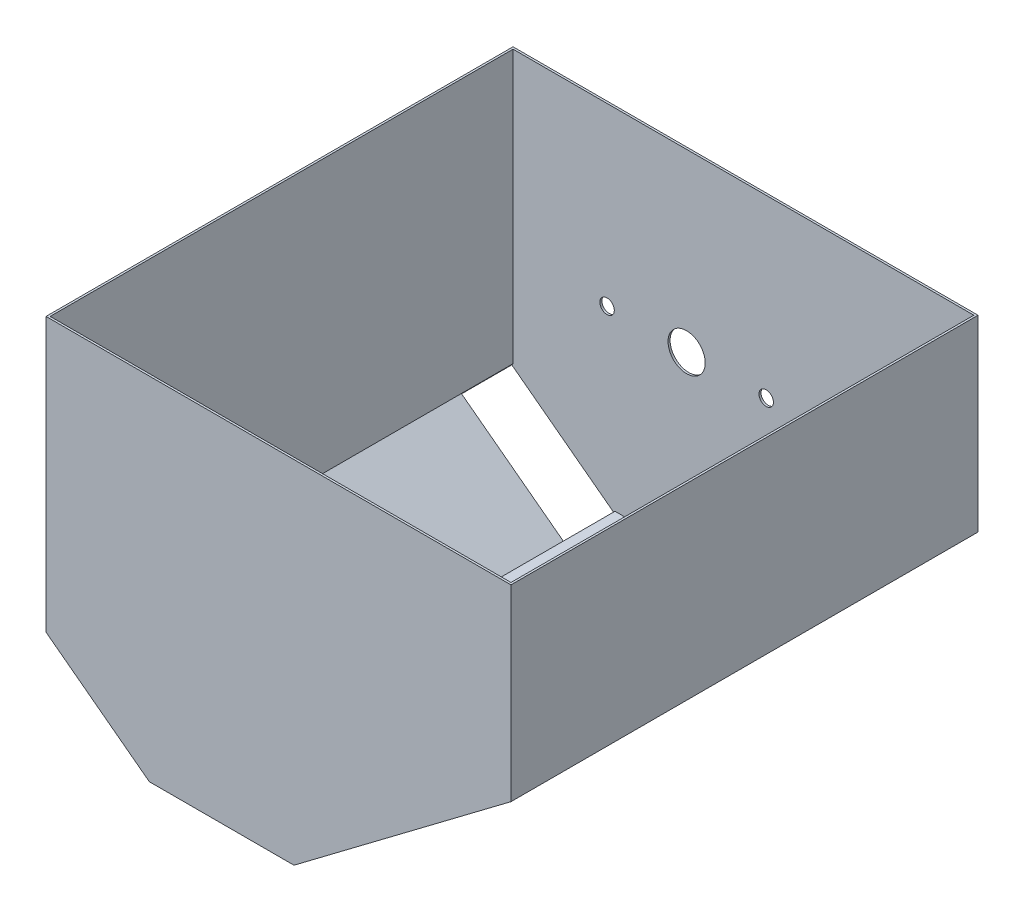
ISO-10303-21;
HEADER;
FILE_DESCRIPTION(('STEP AP214'),'2;1');
FILE_NAME('part.step','',(''),(''),'','','');
FILE_SCHEMA(('AUTOMOTIVE_DESIGN { 1 0 10303 214 1 1 1 1 }'));
ENDSEC;
DATA;
#1=APPLICATION_CONTEXT('core data for automotive mechanical design processes');
#2=APPLICATION_PROTOCOL_DEFINITION('international standard','automotive_design',2000,#1);
#3=PRODUCT_CONTEXT('',#1,'mechanical');
#4=PRODUCT('Part','Part','',(#3));
#5=PRODUCT_RELATED_PRODUCT_CATEGORY('part','',(#4));
#6=PRODUCT_DEFINITION_FORMATION('','',#4);
#7=PRODUCT_DEFINITION_CONTEXT('part definition',#1,'design');
#8=PRODUCT_DEFINITION('design','',#6,#7);
#9=PRODUCT_DEFINITION_SHAPE('','',#8);
#10=(LENGTH_UNIT() NAMED_UNIT(*) SI_UNIT(.MILLI.,.METRE.));
#11=(NAMED_UNIT(*) PLANE_ANGLE_UNIT() SI_UNIT($,.RADIAN.));
#12=(NAMED_UNIT(*) SI_UNIT($,.STERADIAN.) SOLID_ANGLE_UNIT());
#13=UNCERTAINTY_MEASURE_WITH_UNIT(LENGTH_MEASURE(1.E-05),#10,'distance_accuracy_value','');
#14=(GEOMETRIC_REPRESENTATION_CONTEXT(3) GLOBAL_UNCERTAINTY_ASSIGNED_CONTEXT((#13)) GLOBAL_UNIT_ASSIGNED_CONTEXT((#10,
#11,#12)) REPRESENTATION_CONTEXT('',''));
#15=CARTESIAN_POINT('',(0.,0.,0.));
#16=DIRECTION('',(0.,0.,1.));
#17=DIRECTION('',(1.,0.,0.));
#18=AXIS2_PLACEMENT_3D('',#15,#16,#17);
#19=CARTESIAN_POINT('',(-170.,-94.6445949897203,2.));
#20=DIRECTION('',(0.601815023152049,0.798635510047292,0.));
#21=DIRECTION('',(-0.798635510047292,0.60181502315205,0.));
#22=AXIS2_PLACEMENT_3D('',#19,#20,#21);
#23=PLANE('',#22);
#24=DIRECTION('',(-0.798635510047292,0.60181502315205,0.));
#25=VECTOR('',#24,1.);
#26=CARTESIAN_POINT('',(-169.203630046304,-95.2447027937081,2.));
#27=LINE('',#26,#25);
#28=CARTESIAN_POINT('',(-70.5344394073,-169.597271020095,2.));
#29=VERTEX_POINT('',#28);
#30=CARTESIAN_POINT('',(-169.203630046304,-95.2447027937081,2.));
#31=VERTEX_POINT('',#30);
#32=EDGE_CURVE('E153',#29,#31,#27,.T.);
#33=ORIENTED_EDGE('',*,*,#32,.T.);
#34=DIRECTION('',(0.,0.,1.));
#35=VECTOR('',#34,1.);
#36=CARTESIAN_POINT('',(-169.203630046304,-95.2447027937081,2.));
#37=LINE('',#36,#35);
#38=CARTESIAN_POINT('',(-169.203630046304,-95.2447027937081,52.));
#39=VERTEX_POINT('',#38);
#40=EDGE_CURVE('E146',#31,#39,#37,.T.);
#41=ORIENTED_EDGE('',*,*,#40,.T.);
#42=DIRECTION('',(0.798635510047292,-0.60181502315205,0.));
#43=VECTOR('',#42,1.);
#44=CARTESIAN_POINT('',(-169.203630046304,-95.2447027937081,52.));
#45=LINE('',#44,#43);
#46=CARTESIAN_POINT('',(-70.5344394072998,-169.597271020095,52.));
#47=VERTEX_POINT('',#46);
#48=EDGE_CURVE('E156',#39,#47,#45,.T.);
#49=ORIENTED_EDGE('',*,*,#48,.T.);
#50=DIRECTION('',(0.,0.,-1.));
#51=VECTOR('',#50,1.);
#52=CARTESIAN_POINT('',(-70.5344394073,-169.597271020095,2.));
#53=LINE('',#52,#51);
#54=EDGE_CURVE('E52',#47,#29,#53,.T.);
#55=ORIENTED_EDGE('',*,*,#54,.T.);
#56=EDGE_LOOP('',(#33,#41,#49,#55));
#57=FACE_BOUND('',#56,.T.);
#58=DIRECTION('',(0.798635510047292,-0.601815023152049,0.));
#59=VECTOR('',#58,1.);
#60=CARTESIAN_POINT('',(-170.,-94.6445949897203,0.));
#61=LINE('',#60,#59);
#62=CARTESIAN_POINT('',(-170.,-94.6445949897203,0.));
#63=VERTEX_POINT('',#62);
#64=CARTESIAN_POINT('',(-70.,-170.,0.));
#65=VERTEX_POINT('',#64);
#66=EDGE_CURVE('E244',#63,#65,#61,.T.);
#67=ORIENTED_EDGE('',*,*,#66,.T.);
#68=DIRECTION('',(0.,0.,-1.));
#69=VECTOR('',#68,1.);
#70=CARTESIAN_POINT('',(-70.,-170.,2.));
#71=LINE('',#70,#69);
#72=CARTESIAN_POINT('',(-70.,-170.,452.));
#73=VERTEX_POINT('',#72);
#74=EDGE_CURVE('E45',#73,#65,#71,.T.);
#75=ORIENTED_EDGE('',*,*,#74,.F.);
#76=DIRECTION('',(0.798635510047292,-0.601815023152049,0.));
#77=VECTOR('',#76,1.);
#78=CARTESIAN_POINT('',(-70.,-170.,452.));
#79=LINE('',#78,#77);
#80=CARTESIAN_POINT('',(-170.,-94.6445949897203,452.));
#81=VERTEX_POINT('',#80);
#82=EDGE_CURVE('E205',#81,#73,#79,.T.);
#83=ORIENTED_EDGE('',*,*,#82,.F.);
#84=DIRECTION('',(0.,0.,-1.));
#85=VECTOR('',#84,1.);
#86=CARTESIAN_POINT('',(-170.,-94.6445949897203,2.));
#87=LINE('',#86,#85);
#88=EDGE_CURVE('E248',#81,#63,#87,.T.);
#89=ORIENTED_EDGE('',*,*,#88,.T.);
#90=EDGE_LOOP('',(#67,#75,#83,#89));
#91=FACE_BOUND('',#90,.T.);
#92=ADVANCED_FACE('F38',(#57,#91),#23,.F.);
#93=CARTESIAN_POINT('',(-70.,-170.,2.));
#94=DIRECTION('',(0.,1.,0.));
#95=DIRECTION('',(-1.,0.,0.));
#96=AXIS2_PLACEMENT_3D('',#93,#94,#95);
#97=PLANE('',#96);
#98=DIRECTION('',(1.,0.,0.));
#99=VECTOR('',#98,1.);
#100=CARTESIAN_POINT('',(-70.,-170.,0.));
#101=LINE('',#100,#99);
#102=CARTESIAN_POINT('',(70.,-170.,0.));
#103=VERTEX_POINT('',#102);
#104=EDGE_CURVE('E252',#65,#103,#101,.T.);
#105=ORIENTED_EDGE('',*,*,#104,.T.);
#106=DIRECTION('',(0.,0.,-1.));
#107=VECTOR('',#106,1.);
#108=CARTESIAN_POINT('',(70.,-170.,2.));
#109=LINE('',#108,#107);
#110=CARTESIAN_POINT('',(70.,-170.,452.));
#111=VERTEX_POINT('',#110);
#112=EDGE_CURVE('E273',#111,#103,#109,.T.);
#113=ORIENTED_EDGE('',*,*,#112,.F.);
#114=DIRECTION('',(1.,0.,0.));
#115=VECTOR('',#114,1.);
#116=CARTESIAN_POINT('',(70.,-170.,452.));
#117=LINE('',#116,#115);
#118=EDGE_CURVE('E209',#73,#111,#117,.T.);
#119=ORIENTED_EDGE('',*,*,#118,.F.);
#120=ORIENTED_EDGE('',*,*,#74,.T.);
#121=EDGE_LOOP('',(#105,#113,#119,#120));
#122=FACE_BOUND('',#121,.T.);
#123=ADVANCED_FACE('F277',(#122),#97,.F.);
#124=CARTESIAN_POINT('',(70.,-170.,2.));
#125=DIRECTION('',(-0.60181502315205,0.798635510047292,0.));
#126=DIRECTION('',(-0.798635510047292,-0.60181502315205,0.));
#127=AXIS2_PLACEMENT_3D('',#124,#125,#126);
#128=PLANE('',#127);
#129=DIRECTION('',(0.798635510047292,0.60181502315205,0.));
#130=VECTOR('',#129,1.);
#131=CARTESIAN_POINT('',(70.,-170.,0.));
#132=LINE('',#131,#130);
#133=CARTESIAN_POINT('',(280.,-11.7536494784126,0.));
#134=VERTEX_POINT('',#133);
#135=EDGE_CURVE('E255',#103,#134,#132,.T.);
#136=ORIENTED_EDGE('',*,*,#135,.T.);
#137=DIRECTION('',(0.,0.,-1.));
#138=VECTOR('',#137,1.);
#139=CARTESIAN_POINT('',(280.,-11.7536494784126,2.));
#140=LINE('',#139,#138);
#141=CARTESIAN_POINT('',(280.,-11.7536494784126,452.));
#142=VERTEX_POINT('',#141);
#143=EDGE_CURVE('E271',#142,#134,#140,.T.);
#144=ORIENTED_EDGE('',*,*,#143,.F.);
#145=DIRECTION('',(0.798635510047292,0.60181502315205,0.));
#146=VECTOR('',#145,1.);
#147=CARTESIAN_POINT('',(280.,-11.7536494784126,452.));
#148=LINE('',#147,#146);
#149=EDGE_CURVE('E212',#111,#142,#148,.T.);
#150=ORIENTED_EDGE('',*,*,#149,.F.);
#151=ORIENTED_EDGE('',*,*,#112,.T.);
#152=EDGE_LOOP('',(#136,#144,#150,#151));
#153=FACE_BOUND('',#152,.T.);
#154=ADVANCED_FACE('F298',(#153),#128,.F.);
#155=CARTESIAN_POINT('',(280.,-11.7536494784126,2.));
#156=DIRECTION('',(-1.,0.,0.));
#157=DIRECTION('',(0.,-1.,0.));
#158=AXIS2_PLACEMENT_3D('',#155,#156,#157);
#159=PLANE('',#158);
#160=DIRECTION('',(0.,1.,0.));
#161=VECTOR('',#160,1.);
#162=CARTESIAN_POINT('',(280.,-11.7536494784126,0.));
#163=LINE('',#162,#161);
#164=CARTESIAN_POINT('',(280.,170.,0.));
#165=VERTEX_POINT('',#164);
#166=EDGE_CURVE('E258',#134,#165,#163,.T.);
#167=ORIENTED_EDGE('',*,*,#166,.T.);
#168=DIRECTION('',(0.,0.,-1.));
#169=VECTOR('',#168,1.);
#170=CARTESIAN_POINT('',(280.,170.,2.));
#171=LINE('',#170,#169);
#172=CARTESIAN_POINT('',(280.,170.,452.));
#173=VERTEX_POINT('',#172);
#174=EDGE_CURVE('E269',#173,#165,#171,.T.);
#175=ORIENTED_EDGE('',*,*,#174,.F.);
#176=DIRECTION('',(0.,1.,0.));
#177=VECTOR('',#176,1.);
#178=CARTESIAN_POINT('',(280.,170.,452.));
#179=LINE('',#178,#177);
#180=EDGE_CURVE('E215',#142,#173,#179,.T.);
#181=ORIENTED_EDGE('',*,*,#180,.F.);
#182=ORIENTED_EDGE('',*,*,#143,.T.);
#183=EDGE_LOOP('',(#167,#175,#181,#182));
#184=FACE_BOUND('',#183,.T.);
#185=ADVANCED_FACE('F295',(#184),#159,.F.);
#186=CARTESIAN_POINT('',(280.,170.,2.));
#187=DIRECTION('',(0.,-1.,0.));
#188=DIRECTION('',(1.,0.,0.));
#189=AXIS2_PLACEMENT_3D('',#186,#187,#188);
#190=PLANE('',#189);
#191=DIRECTION('',(-1.,0.,0.));
#192=VECTOR('',#191,1.);
#193=CARTESIAN_POINT('',(-170.,170.,450.));
#194=LINE('',#193,#192);
#195=CARTESIAN_POINT('',(278.,170.,450.));
#196=VERTEX_POINT('',#195);
#197=CARTESIAN_POINT('',(-168.,170.,450.));
#198=VERTEX_POINT('',#197);
#199=EDGE_CURVE('E184',#196,#198,#194,.T.);
#200=ORIENTED_EDGE('',*,*,#199,.T.);
#201=DIRECTION('',(0.,0.,-1.));
#202=VECTOR('',#201,1.);
#203=CARTESIAN_POINT('',(-168.,170.,452.));
#204=LINE('',#203,#202);
#205=CARTESIAN_POINT('',(-168.,170.,2.));
#206=VERTEX_POINT('',#205);
#207=EDGE_CURVE('E220',#198,#206,#204,.T.);
#208=ORIENTED_EDGE('',*,*,#207,.T.);
#209=DIRECTION('',(-1.,0.,0.));
#210=VECTOR('',#209,1.);
#211=CARTESIAN_POINT('',(280.,170.,2.));
#212=LINE('',#211,#210);
#213=CARTESIAN_POINT('',(278.,170.,2.));
#214=VERTEX_POINT('',#213);
#215=EDGE_CURVE('E245',#214,#206,#212,.T.);
#216=ORIENTED_EDGE('',*,*,#215,.F.);
#217=DIRECTION('',(0.,0.,-1.));
#218=VECTOR('',#217,1.);
#219=CARTESIAN_POINT('',(278.,170.,452.));
#220=LINE('',#219,#218);
#221=EDGE_CURVE('E242',#196,#214,#220,.T.);
#222=ORIENTED_EDGE('',*,*,#221,.F.);
#223=EDGE_LOOP('',(#200,#208,#216,#222));
#224=FACE_BOUND('',#223,.T.);
#225=DIRECTION('',(-1.,0.,0.));
#226=VECTOR('',#225,1.);
#227=CARTESIAN_POINT('',(280.,170.,0.));
#228=LINE('',#227,#226);
#229=CARTESIAN_POINT('',(-170.,170.,0.));
#230=VERTEX_POINT('',#229);
#231=EDGE_CURVE('E261',#165,#230,#228,.T.);
#232=ORIENTED_EDGE('',*,*,#231,.T.);
#233=DIRECTION('',(0.,0.,-1.));
#234=VECTOR('',#233,1.);
#235=CARTESIAN_POINT('',(-170.,170.,2.));
#236=LINE('',#235,#234);
#237=CARTESIAN_POINT('',(-170.,170.,452.));
#238=VERTEX_POINT('',#237);
#239=EDGE_CURVE('E267',#238,#230,#236,.T.);
#240=ORIENTED_EDGE('',*,*,#239,.F.);
#241=DIRECTION('',(-1.,0.,0.));
#242=VECTOR('',#241,1.);
#243=CARTESIAN_POINT('',(278.,170.,452.));
#244=LINE('',#243,#242);
#245=EDGE_CURVE('E218',#173,#238,#244,.T.);
#246=ORIENTED_EDGE('',*,*,#245,.F.);
#247=ORIENTED_EDGE('',*,*,#174,.T.);
#248=EDGE_LOOP('',(#232,#240,#246,#247));
#249=FACE_BOUND('',#248,.T.);
#250=ADVANCED_FACE('F291',(#224,#249),#190,.F.);
#251=CARTESIAN_POINT('',(-170.,170.,2.));
#252=DIRECTION('',(1.,0.,0.));
#253=DIRECTION('',(0.,1.,0.));
#254=AXIS2_PLACEMENT_3D('',#251,#252,#253);
#255=PLANE('',#254);
#256=DIRECTION('',(0.,-1.,0.));
#257=VECTOR('',#256,1.);
#258=CARTESIAN_POINT('',(-170.,170.,0.));
#259=LINE('',#258,#257);
#260=EDGE_CURVE('E249',#230,#63,#259,.T.);
#261=ORIENTED_EDGE('',*,*,#260,.T.);
#262=ORIENTED_EDGE('',*,*,#88,.F.);
#263=DIRECTION('',(0.,-1.,0.));
#264=VECTOR('',#263,1.);
#265=CARTESIAN_POINT('',(-170.,-94.6445949897203,452.));
#266=LINE('',#265,#264);
#267=EDGE_CURVE('E202',#238,#81,#266,.T.);
#268=ORIENTED_EDGE('',*,*,#267,.F.);
#269=ORIENTED_EDGE('',*,*,#239,.T.);
#270=EDGE_LOOP('',(#261,#262,#268,#269));
#271=FACE_BOUND('',#270,.T.);
#272=ADVANCED_FACE('F287',(#271),#255,.F.);
#273=CARTESIAN_POINT('',(0.,0.,2.));
#274=DIRECTION('',(0.,0.,1.));
#275=DIRECTION('',(1.,0.,0.));
#276=AXIS2_PLACEMENT_3D('',#273,#274,#275);
#277=PLANE('',#276);
#278=CARTESIAN_POINT('',(-77.,0.,2.));
#279=DIRECTION('',(0.,0.,-1.));
#280=DIRECTION('',(-1.,0.,0.));
#281=AXIS2_PLACEMENT_3D('',#278,#279,#280);
#282=CIRCLE('',#281,7.);
#283=CARTESIAN_POINT('',(-84.,0.,2.));
#284=VERTEX_POINT('',#283);
#285=EDGE_CURVE('E174',#284,#284,#282,.T.);
#286=ORIENTED_EDGE('',*,*,#285,.T.);
#287=EDGE_LOOP('',(#286));
#288=FACE_BOUND('',#287,.T.);
#289=CARTESIAN_POINT('',(77.,0.,2.));
#290=DIRECTION('',(0.,0.,-1.));
#291=DIRECTION('',(1.,0.,0.));
#292=AXIS2_PLACEMENT_3D('',#289,#290,#291);
#293=CIRCLE('',#292,7.);
#294=CARTESIAN_POINT('',(84.,0.,2.));
#295=VERTEX_POINT('',#294);
#296=EDGE_CURVE('E168',#295,#295,#293,.T.);
#297=ORIENTED_EDGE('',*,*,#296,.T.);
#298=EDGE_LOOP('',(#297));
#299=FACE_BOUND('',#298,.T.);
#300=CARTESIAN_POINT('',(0.,0.,2.));
#301=DIRECTION('',(0.,0.,1.));
#302=DIRECTION('',(1.,0.,0.));
#303=AXIS2_PLACEMENT_3D('',#300,#301,#302);
#304=CIRCLE('',#303,18.);
#305=CARTESIAN_POINT('',(18.,0.,2.));
#306=VERTEX_POINT('',#305);
#307=EDGE_CURVE('E177',#306,#306,#304,.T.);
#308=ORIENTED_EDGE('',*,*,#307,.F.);
#309=EDGE_LOOP('',(#308));
#310=FACE_BOUND('',#309,.T.);
#311=DIRECTION('',(0.,1.,0.));
#312=VECTOR('',#311,1.);
#313=CARTESIAN_POINT('',(-168.,170.,2.));
#314=LINE('',#313,#312);
#315=CARTESIAN_POINT('',(-168.,-93.6474317736134,2.));
#316=VERTEX_POINT('',#315);
#317=EDGE_CURVE('E206',#316,#206,#314,.T.);
#318=ORIENTED_EDGE('',*,*,#317,.F.);
#319=DIRECTION('',(0.60181502315205,0.798635510047292,0.));
#320=VECTOR('',#319,1.);
#321=CARTESIAN_POINT('',(-169.203630046304,-95.2447027937081,2.));
#322=LINE('',#321,#320);
#323=EDGE_CURVE('E60',#31,#316,#322,.T.);
#324=ORIENTED_EDGE('',*,*,#323,.F.);
#325=ORIENTED_EDGE('',*,*,#32,.F.);
#326=DIRECTION('',(0.60181502315205,0.798635510047292,0.));
#327=VECTOR('',#326,1.);
#328=CARTESIAN_POINT('',(-70.5344394073,-169.597271020095,2.));
#329=LINE('',#328,#327);
#330=CARTESIAN_POINT('',(-69.3308093609959,-168.,2.));
#331=VERTEX_POINT('',#330);
#332=EDGE_CURVE('E178',#29,#331,#329,.T.);
#333=ORIENTED_EDGE('',*,*,#332,.T.);
#334=DIRECTION('',(-1.,0.,0.));
#335=VECTOR('',#334,1.);
#336=CARTESIAN_POINT('',(-69.3308093609958,-168.,2.));
#337=LINE('',#336,#335);
#338=CARTESIAN_POINT('',(69.3308093609959,-168.,2.));
#339=VERTEX_POINT('',#338);
#340=EDGE_CURVE('E226',#339,#331,#337,.T.);
#341=ORIENTED_EDGE('',*,*,#340,.F.);
#342=DIRECTION('',(-0.798635510047292,-0.60181502315205,0.));
#343=VECTOR('',#342,1.);
#344=CARTESIAN_POINT('',(69.3308093609959,-168.,2.));
#345=LINE('',#344,#343);
#346=CARTESIAN_POINT('',(278.,-10.7564862623057,2.));
#347=VERTEX_POINT('',#346);
#348=EDGE_CURVE('E223',#347,#339,#345,.T.);
#349=ORIENTED_EDGE('',*,*,#348,.F.);
#350=DIRECTION('',(0.,-1.,0.));
#351=VECTOR('',#350,1.);
#352=CARTESIAN_POINT('',(278.,-10.7564862623057,2.));
#353=LINE('',#352,#351);
#354=EDGE_CURVE('E201',#214,#347,#353,.T.);
#355=ORIENTED_EDGE('',*,*,#354,.F.);
#356=ORIENTED_EDGE('',*,*,#215,.T.);
#357=EDGE_LOOP('',(#318,#324,#325,#333,#341,#349,#355,#356));
#358=FACE_BOUND('',#357,.T.);
#359=ADVANCED_FACE('F331',(#288,#299,#310,#358),#277,.T.);
#360=CARTESIAN_POINT('',(0.,0.,0.));
#361=DIRECTION('',(0.,0.,1.));
#362=DIRECTION('',(1.,0.,0.));
#363=AXIS2_PLACEMENT_3D('',#360,#361,#362);
#364=PLANE('',#363);
#365=CARTESIAN_POINT('',(-77.,0.,0.));
#366=DIRECTION('',(0.,0.,-1.));
#367=DIRECTION('',(-1.,0.,0.));
#368=AXIS2_PLACEMENT_3D('',#365,#366,#367);
#369=CIRCLE('',#368,7.);
#370=CARTESIAN_POINT('',(-84.,0.,0.));
#371=VERTEX_POINT('',#370);
#372=EDGE_CURVE('E584',#371,#371,#369,.T.);
#373=ORIENTED_EDGE('',*,*,#372,.F.);
#374=EDGE_LOOP('',(#373));
#375=FACE_BOUND('',#374,.T.);
#376=CARTESIAN_POINT('',(77.,0.,0.));
#377=DIRECTION('',(0.,0.,-1.));
#378=DIRECTION('',(1.,0.,0.));
#379=AXIS2_PLACEMENT_3D('',#376,#377,#378);
#380=CIRCLE('',#379,7.);
#381=CARTESIAN_POINT('',(84.,0.,0.));
#382=VERTEX_POINT('',#381);
#383=EDGE_CURVE('E585',#382,#382,#380,.T.);
#384=ORIENTED_EDGE('',*,*,#383,.F.);
#385=EDGE_LOOP('',(#384));
#386=FACE_BOUND('',#385,.T.);
#387=CARTESIAN_POINT('',(0.,0.,0.));
#388=DIRECTION('',(0.,0.,1.));
#389=DIRECTION('',(1.,0.,0.));
#390=AXIS2_PLACEMENT_3D('',#387,#388,#389);
#391=CIRCLE('',#390,18.);
#392=CARTESIAN_POINT('',(18.,0.,0.));
#393=VERTEX_POINT('',#392);
#394=EDGE_CURVE('E181',#393,#393,#391,.T.);
#395=ORIENTED_EDGE('',*,*,#394,.T.);
#396=EDGE_LOOP('',(#395));
#397=FACE_BOUND('',#396,.T.);
#398=ORIENTED_EDGE('',*,*,#66,.F.);
#399=ORIENTED_EDGE('',*,*,#260,.F.);
#400=ORIENTED_EDGE('',*,*,#231,.F.);
#401=ORIENTED_EDGE('',*,*,#166,.F.);
#402=ORIENTED_EDGE('',*,*,#135,.F.);
#403=ORIENTED_EDGE('',*,*,#104,.F.);
#404=EDGE_LOOP('',(#398,#399,#400,#401,#402,#403));
#405=FACE_BOUND('',#404,.T.);
#406=ADVANCED_FACE('F282',(#375,#386,#397,#405),#364,.F.);
#407=CARTESIAN_POINT('',(278.,-10.7564862623057,452.));
#408=DIRECTION('',(1.,0.,0.));
#409=DIRECTION('',(0.,1.,0.));
#410=AXIS2_PLACEMENT_3D('',#407,#408,#409);
#411=PLANE('',#410);
#412=DIRECTION('',(0.,0.,-1.));
#413=VECTOR('',#412,1.);
#414=CARTESIAN_POINT('',(278.,-10.7564862623057,452.));
#415=LINE('',#414,#413);
#416=CARTESIAN_POINT('',(278.,-10.7564862623057,450.));
#417=VERTEX_POINT('',#416);
#418=EDGE_CURVE('E240',#417,#347,#415,.T.);
#419=ORIENTED_EDGE('',*,*,#418,.F.);
#420=DIRECTION('',(0.,1.,0.));
#421=VECTOR('',#420,1.);
#422=CARTESIAN_POINT('',(278.,-10.7564862623057,450.));
#423=LINE('',#422,#421);
#424=EDGE_CURVE('E198',#417,#196,#423,.T.);
#425=ORIENTED_EDGE('',*,*,#424,.T.);
#426=ORIENTED_EDGE('',*,*,#221,.T.);
#427=ORIENTED_EDGE('',*,*,#354,.T.);
#428=EDGE_LOOP('',(#419,#425,#426,#427));
#429=FACE_BOUND('',#428,.T.);
#430=ADVANCED_FACE('F334',(#429),#411,.F.);
#431=CARTESIAN_POINT('',(69.3308093609959,-168.,452.));
#432=DIRECTION('',(0.60181502315205,-0.798635510047292,0.));
#433=DIRECTION('',(0.798635510047292,0.60181502315205,0.));
#434=AXIS2_PLACEMENT_3D('',#431,#432,#433);
#435=PLANE('',#434);
#436=DIRECTION('',(0.,0.,-1.));
#437=VECTOR('',#436,1.);
#438=CARTESIAN_POINT('',(69.3308093609959,-168.,452.));
#439=LINE('',#438,#437);
#440=CARTESIAN_POINT('',(69.3308093609959,-168.,450.));
#441=VERTEX_POINT('',#440);
#442=EDGE_CURVE('E238',#441,#339,#439,.T.);
#443=ORIENTED_EDGE('',*,*,#442,.F.);
#444=DIRECTION('',(0.798635510047292,0.60181502315205,0.));
#445=VECTOR('',#444,1.);
#446=CARTESIAN_POINT('',(69.3308093609959,-168.,450.));
#447=LINE('',#446,#445);
#448=EDGE_CURVE('E195',#441,#417,#447,.T.);
#449=ORIENTED_EDGE('',*,*,#448,.T.);
#450=ORIENTED_EDGE('',*,*,#418,.T.);
#451=ORIENTED_EDGE('',*,*,#348,.T.);
#452=EDGE_LOOP('',(#443,#449,#450,#451));
#453=FACE_BOUND('',#452,.T.);
#454=ADVANCED_FACE('F341',(#453),#435,.F.);
#455=CARTESIAN_POINT('',(-69.3308093609958,-168.,452.));
#456=DIRECTION('',(0.,-1.,0.));
#457=DIRECTION('',(0.,0.,-1.));
#458=AXIS2_PLACEMENT_3D('',#455,#456,#457);
#459=PLANE('',#458);
#460=DIRECTION('',(0.,0.,-1.));
#461=VECTOR('',#460,1.);
#462=CARTESIAN_POINT('',(-69.3308093609958,-168.,452.));
#463=LINE('',#462,#461);
#464=CARTESIAN_POINT('',(-69.3308093609958,-168.,450.));
#465=VERTEX_POINT('',#464);
#466=CARTESIAN_POINT('',(-69.3308093609959,-168.,52.));
#467=VERTEX_POINT('',#466);
#468=EDGE_CURVE('E235',#465,#467,#463,.T.);
#469=ORIENTED_EDGE('',*,*,#468,.F.);
#470=DIRECTION('',(1.,0.,0.));
#471=VECTOR('',#470,1.);
#472=CARTESIAN_POINT('',(-69.3308093609958,-168.,450.));
#473=LINE('',#472,#471);
#474=EDGE_CURVE('E192',#465,#441,#473,.T.);
#475=ORIENTED_EDGE('',*,*,#474,.T.);
#476=ORIENTED_EDGE('',*,*,#442,.T.);
#477=ORIENTED_EDGE('',*,*,#340,.T.);
#478=DIRECTION('',(0.,0.,-1.));
#479=VECTOR('',#478,1.);
#480=CARTESIAN_POINT('',(-69.3308093609959,-168.,2.));
#481=LINE('',#480,#479);
#482=EDGE_CURVE('E162',#467,#331,#481,.T.);
#483=ORIENTED_EDGE('',*,*,#482,.F.);
#484=EDGE_LOOP('',(#469,#475,#476,#477,#483));
#485=FACE_BOUND('',#484,.T.);
#486=ADVANCED_FACE('F345',(#485),#459,.F.);
#487=CARTESIAN_POINT('',(-168.,-93.6474317736134,452.));
#488=DIRECTION('',(-0.601815023152049,-0.798635510047292,0.));
#489=DIRECTION('',(0.798635510047292,-0.601815023152049,0.));
#490=AXIS2_PLACEMENT_3D('',#487,#488,#489);
#491=PLANE('',#490);
#492=ORIENTED_EDGE('',*,*,#468,.T.);
#493=DIRECTION('',(0.798635510047292,-0.60181502315205,0.));
#494=VECTOR('',#493,1.);
#495=CARTESIAN_POINT('',(-168.,-93.6474317736135,52.));
#496=LINE('',#495,#494);
#497=CARTESIAN_POINT('',(-168.,-93.6474317736135,52.));
#498=VERTEX_POINT('',#497);
#499=EDGE_CURVE('E165',#498,#467,#496,.T.);
#500=ORIENTED_EDGE('',*,*,#499,.F.);
#501=DIRECTION('',(0.,0.,-1.));
#502=VECTOR('',#501,1.);
#503=CARTESIAN_POINT('',(-168.,-93.6474317736134,452.));
#504=LINE('',#503,#502);
#505=CARTESIAN_POINT('',(-168.,-93.6474317736135,450.));
#506=VERTEX_POINT('',#505);
#507=EDGE_CURVE('E232',#506,#498,#504,.T.);
#508=ORIENTED_EDGE('',*,*,#507,.F.);
#509=DIRECTION('',(0.798635510047292,-0.601815023152049,0.));
#510=VECTOR('',#509,1.);
#511=CARTESIAN_POINT('',(-168.,-93.6474317736134,450.));
#512=LINE('',#511,#510);
#513=EDGE_CURVE('E189',#506,#465,#512,.T.);
#514=ORIENTED_EDGE('',*,*,#513,.T.);
#515=EDGE_LOOP('',(#492,#500,#508,#514));
#516=FACE_BOUND('',#515,.T.);
#517=ADVANCED_FACE('F312',(#516),#491,.F.);
#518=CARTESIAN_POINT('',(-168.,170.,452.));
#519=DIRECTION('',(-1.,0.,0.));
#520=DIRECTION('',(0.,-1.,0.));
#521=AXIS2_PLACEMENT_3D('',#518,#519,#520);
#522=PLANE('',#521);
#523=ORIENTED_EDGE('',*,*,#207,.F.);
#524=DIRECTION('',(0.,-1.,0.));
#525=VECTOR('',#524,1.);
#526=CARTESIAN_POINT('',(-168.,170.,450.));
#527=LINE('',#526,#525);
#528=EDGE_CURVE('E11',#198,#506,#527,.T.);
#529=ORIENTED_EDGE('',*,*,#528,.T.);
#530=ORIENTED_EDGE('',*,*,#507,.T.);
#531=DIRECTION('',(0.,0.,1.));
#532=VECTOR('',#531,1.);
#533=CARTESIAN_POINT('',(-168.,-93.6474317736135,2.));
#534=LINE('',#533,#532);
#535=EDGE_CURVE('E148',#316,#498,#534,.T.);
#536=ORIENTED_EDGE('',*,*,#535,.F.);
#537=ORIENTED_EDGE('',*,*,#317,.T.);
#538=EDGE_LOOP('',(#523,#529,#530,#536,#537));
#539=FACE_BOUND('',#538,.T.);
#540=ADVANCED_FACE('F303',(#539),#522,.F.);
#541=CARTESIAN_POINT('',(0.,0.,452.));
#542=DIRECTION('',(0.,0.,-1.));
#543=DIRECTION('',(-1.,0.,0.));
#544=AXIS2_PLACEMENT_3D('',#541,#542,#543);
#545=PLANE('',#544);
#546=ORIENTED_EDGE('',*,*,#267,.T.);
#547=ORIENTED_EDGE('',*,*,#82,.T.);
#548=ORIENTED_EDGE('',*,*,#118,.T.);
#549=ORIENTED_EDGE('',*,*,#149,.T.);
#550=ORIENTED_EDGE('',*,*,#180,.T.);
#551=ORIENTED_EDGE('',*,*,#245,.T.);
#552=EDGE_LOOP('',(#546,#547,#548,#549,#550,#551));
#553=FACE_BOUND('',#552,.T.);
#554=ADVANCED_FACE('F300',(#553),#545,.F.);
#555=CARTESIAN_POINT('',(0.,0.,450.));
#556=DIRECTION('',(0.,0.,-1.));
#557=DIRECTION('',(-1.,0.,0.));
#558=AXIS2_PLACEMENT_3D('',#555,#556,#557);
#559=PLANE('',#558);
#560=ORIENTED_EDGE('',*,*,#424,.F.);
#561=ORIENTED_EDGE('',*,*,#448,.F.);
#562=ORIENTED_EDGE('',*,*,#474,.F.);
#563=ORIENTED_EDGE('',*,*,#513,.F.);
#564=ORIENTED_EDGE('',*,*,#528,.F.);
#565=ORIENTED_EDGE('',*,*,#199,.F.);
#566=EDGE_LOOP('',(#560,#561,#562,#563,#564,#565));
#567=FACE_BOUND('',#566,.T.);
#568=ADVANCED_FACE('F302',(#567),#559,.T.);
#569=CARTESIAN_POINT('',(0.,0.,0.));
#570=DIRECTION('',(0.,0.,1.));
#571=DIRECTION('',(1.,0.,0.));
#572=AXIS2_PLACEMENT_3D('',#569,#570,#571);
#573=CYLINDRICAL_SURFACE('',#572,18.);
#574=ORIENTED_EDGE('',*,*,#394,.F.);
#575=EDGE_LOOP('',(#574));
#576=FACE_BOUND('',#575,.T.);
#577=ORIENTED_EDGE('',*,*,#307,.T.);
#578=EDGE_LOOP('',(#577));
#579=FACE_BOUND('',#578,.T.);
#580=ADVANCED_FACE('F309',(#576,#579),#573,.F.);
#581=CARTESIAN_POINT('',(-169.203630046304,-95.2447027937081,2.));
#582=DIRECTION('',(-0.798635510047292,0.60181502315205,0.));
#583=DIRECTION('',(-0.60181502315205,-0.798635510047292,0.));
#584=AXIS2_PLACEMENT_3D('',#581,#582,#583);
#585=PLANE('',#584);
#586=ORIENTED_EDGE('',*,*,#535,.T.);
#587=DIRECTION('',(0.60181502315205,0.798635510047292,0.));
#588=VECTOR('',#587,1.);
#589=CARTESIAN_POINT('',(-169.203630046304,-95.2447027937081,52.));
#590=LINE('',#589,#588);
#591=EDGE_CURVE('E142',#39,#498,#590,.T.);
#592=ORIENTED_EDGE('',*,*,#591,.F.);
#593=ORIENTED_EDGE('',*,*,#40,.F.);
#594=ORIENTED_EDGE('',*,*,#323,.T.);
#595=EDGE_LOOP('',(#586,#592,#593,#594));
#596=FACE_BOUND('',#595,.T.);
#597=ADVANCED_FACE('F144',(#596),#585,.F.);
#598=CARTESIAN_POINT('',(-70.5344394073,-169.597271020095,2.));
#599=DIRECTION('',(0.798635510047292,-0.60181502315205,0.));
#600=DIRECTION('',(0.60181502315205,0.798635510047292,0.));
#601=AXIS2_PLACEMENT_3D('',#598,#599,#600);
#602=PLANE('',#601);
#603=ORIENTED_EDGE('',*,*,#482,.T.);
#604=ORIENTED_EDGE('',*,*,#332,.F.);
#605=ORIENTED_EDGE('',*,*,#54,.F.);
#606=DIRECTION('',(0.60181502315205,0.798635510047292,0.));
#607=VECTOR('',#606,1.);
#608=CARTESIAN_POINT('',(-70.5344394073,-169.597271020095,52.));
#609=LINE('',#608,#607);
#610=EDGE_CURVE('E152',#47,#467,#609,.T.);
#611=ORIENTED_EDGE('',*,*,#610,.T.);
#612=EDGE_LOOP('',(#603,#604,#605,#611));
#613=FACE_BOUND('',#612,.T.);
#614=ADVANCED_FACE('F359',(#613),#602,.F.);
#615=CARTESIAN_POINT('',(-169.203630046304,-95.2447027937081,52.));
#616=DIRECTION('',(0.,0.,1.));
#617=DIRECTION('',(1.,0.,0.));
#618=AXIS2_PLACEMENT_3D('',#615,#616,#617);
#619=PLANE('',#618);
#620=ORIENTED_EDGE('',*,*,#499,.T.);
#621=ORIENTED_EDGE('',*,*,#610,.F.);
#622=ORIENTED_EDGE('',*,*,#48,.F.);
#623=ORIENTED_EDGE('',*,*,#591,.T.);
#624=EDGE_LOOP('',(#620,#621,#622,#623));
#625=FACE_BOUND('',#624,.T.);
#626=ADVANCED_FACE('F157',(#625),#619,.F.);
#627=CARTESIAN_POINT('',(77.,0.,2.));
#628=DIRECTION('',(0.,0.,-1.));
#629=DIRECTION('',(-1.,0.,0.));
#630=AXIS2_PLACEMENT_3D('',#627,#628,#629);
#631=CYLINDRICAL_SURFACE('',#630,7.);
#632=ORIENTED_EDGE('',*,*,#296,.F.);
#633=EDGE_LOOP('',(#632));
#634=FACE_BOUND('',#633,.T.);
#635=ORIENTED_EDGE('',*,*,#383,.T.);
#636=EDGE_LOOP('',(#635));
#637=FACE_BOUND('',#636,.T.);
#638=ADVANCED_FACE('F374',(#634,#637),#631,.F.);
#639=CARTESIAN_POINT('',(-77.,0.,2.));
#640=DIRECTION('',(0.,0.,-1.));
#641=DIRECTION('',(-1.,0.,0.));
#642=AXIS2_PLACEMENT_3D('',#639,#640,#641);
#643=CYLINDRICAL_SURFACE('',#642,7.);
#644=ORIENTED_EDGE('',*,*,#285,.F.);
#645=EDGE_LOOP('',(#644));
#646=FACE_BOUND('',#645,.T.);
#647=ORIENTED_EDGE('',*,*,#372,.T.);
#648=EDGE_LOOP('',(#647));
#649=FACE_BOUND('',#648,.T.);
#650=ADVANCED_FACE('F435',(#646,#649),#643,.F.);
#651=CLOSED_SHELL('',(#92,#123,#154,#185,#250,#272,#359,#406,#430,#454,#486,#517,#540,#554,#568,
#580,#597,#614,#626,#638,#650));
#652=MANIFOLD_SOLID_BREP('B2',#651);
#653=ADVANCED_BREP_SHAPE_REPRESENTATION('',(#18,#652),#14);
#654=SHAPE_DEFINITION_REPRESENTATION(#9,#653);
ENDSEC;
END-ISO-10303-21;
